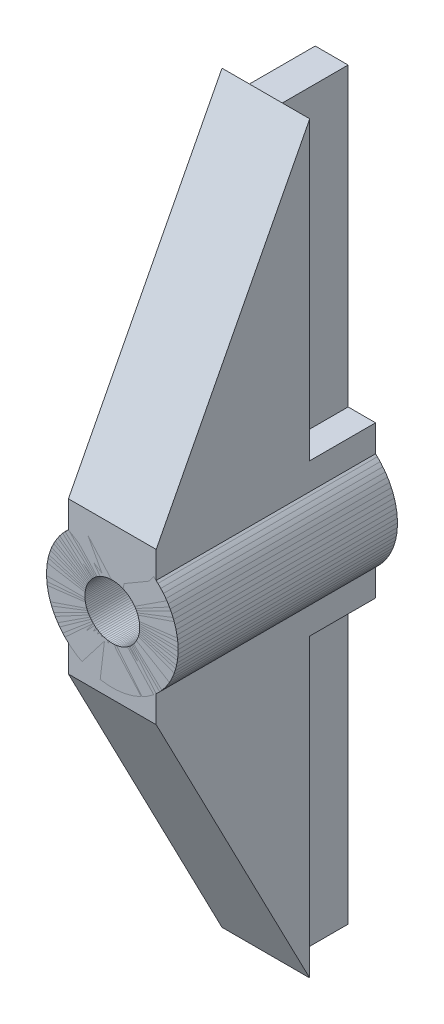
ISO-10303-21;
HEADER;
FILE_DESCRIPTION(('STEP AP214'),'2;1');
FILE_NAME('part.step','',(''),(''),'','','');
FILE_SCHEMA(('AUTOMOTIVE_DESIGN { 1 0 10303 214 1 1 1 1 }'));
ENDSEC;
DATA;
#1=APPLICATION_CONTEXT('core data for automotive mechanical design processes');
#2=APPLICATION_PROTOCOL_DEFINITION('international standard','automotive_design',2000,#1);
#3=PRODUCT_CONTEXT('',#1,'mechanical');
#4=PRODUCT('Part','Part','',(#3));
#5=PRODUCT_RELATED_PRODUCT_CATEGORY('part','',(#4));
#6=PRODUCT_DEFINITION_FORMATION('','',#4);
#7=PRODUCT_DEFINITION_CONTEXT('part definition',#1,'design');
#8=PRODUCT_DEFINITION('design','',#6,#7);
#9=PRODUCT_DEFINITION_SHAPE('','',#8);
#10=(LENGTH_UNIT() NAMED_UNIT(*) SI_UNIT(.MILLI.,.METRE.));
#11=(NAMED_UNIT(*) PLANE_ANGLE_UNIT() SI_UNIT($,.RADIAN.));
#12=(NAMED_UNIT(*) SI_UNIT($,.STERADIAN.) SOLID_ANGLE_UNIT());
#13=UNCERTAINTY_MEASURE_WITH_UNIT(LENGTH_MEASURE(1.E-05),#10,'distance_accuracy_value','');
#14=(GEOMETRIC_REPRESENTATION_CONTEXT(3) GLOBAL_UNCERTAINTY_ASSIGNED_CONTEXT((#13)) GLOBAL_UNIT_ASSIGNED_CONTEXT((#10,
#11,#12)) REPRESENTATION_CONTEXT('',''));
#15=CARTESIAN_POINT('',(0.,0.,0.));
#16=DIRECTION('',(0.,0.,1.));
#17=DIRECTION('',(1.,0.,0.));
#18=AXIS2_PLACEMENT_3D('',#15,#16,#17);
#19=CARTESIAN_POINT('',(0.,0.,20.));
#20=DIRECTION('',(0.,0.,-1.));
#21=DIRECTION('',(1.,0.,0.));
#22=AXIS2_PLACEMENT_3D('',#19,#20,#21);
#23=CYLINDRICAL_SURFACE('',#22,6.);
#24=DIRECTION('',(0.,0.,-1.));
#25=VECTOR('',#24,1.);
#26=CARTESIAN_POINT('',(-3.99999999999997,-4.47213595499961,20.));
#27=LINE('',#26,#25);
#28=CARTESIAN_POINT('',(-3.99999999999997,-4.47213595499961,20.));
#29=VERTEX_POINT('',#28);
#30=CARTESIAN_POINT('',(-3.99999999999997,-4.47213595499961,0.));
#31=VERTEX_POINT('',#30);
#32=EDGE_CURVE('E12',#29,#31,#27,.T.);
#33=ORIENTED_EDGE('',*,*,#32,.F.);
#34=CARTESIAN_POINT('',(0.,0.,20.));
#35=DIRECTION('',(0.,0.,1.));
#36=DIRECTION('',(-1.,0.,0.));
#37=AXIS2_PLACEMENT_3D('',#34,#35,#36);
#38=CIRCLE('',#37,6.);
#39=CARTESIAN_POINT('',(4.00000000000003,-4.47213595499955,20.));
#40=VERTEX_POINT('',#39);
#41=EDGE_CURVE('E210',#40,#29,#38,.T.);
#42=ORIENTED_EDGE('',*,*,#41,.F.);
#43=DIRECTION('',(0.,0.,-1.));
#44=VECTOR('',#43,1.);
#45=CARTESIAN_POINT('',(4.00000000000003,-4.47213595499955,20.));
#46=LINE('',#45,#44);
#47=CARTESIAN_POINT('',(4.00000000000003,-4.47213595499955,0.));
#48=VERTEX_POINT('',#47);
#49=EDGE_CURVE('E62',#40,#48,#46,.T.);
#50=ORIENTED_EDGE('',*,*,#49,.T.);
#51=CARTESIAN_POINT('',(0.,0.,0.));
#52=DIRECTION('',(0.,0.,1.));
#53=DIRECTION('',(-1.,0.,0.));
#54=AXIS2_PLACEMENT_3D('',#51,#52,#53);
#55=CIRCLE('',#54,6.);
#56=EDGE_CURVE('E207',#48,#31,#55,.T.);
#57=ORIENTED_EDGE('',*,*,#56,.T.);
#58=EDGE_LOOP('',(#33,#42,#50,#57));
#59=FACE_BOUND('',#58,.T.);
#60=ADVANCED_FACE('F55',(#59),#23,.T.);
#61=CARTESIAN_POINT('',(0.,0.,20.));
#62=DIRECTION('',(0.,0.,1.));
#63=DIRECTION('',(-1.,0.,0.));
#64=AXIS2_PLACEMENT_3D('',#61,#62,#63);
#65=PLANE('',#64);
#66=ORIENTED_EDGE('',*,*,#41,.T.);
#67=DIRECTION('',(0.,1.,0.));
#68=VECTOR('',#67,1.);
#69=CARTESIAN_POINT('',(-3.99999999999995,-6.91977190049356,20.));
#70=LINE('',#69,#68);
#71=CARTESIAN_POINT('',(-3.99999999999995,-6.91977190049356,20.));
#72=VERTEX_POINT('',#71);
#73=EDGE_CURVE('E183',#72,#29,#70,.T.);
#74=ORIENTED_EDGE('',*,*,#73,.F.);
#75=DIRECTION('',(1.,0.,0.));
#76=VECTOR('',#75,1.);
#77=CARTESIAN_POINT('',(-3.99999999999995,-6.91977190049356,20.));
#78=LINE('',#77,#76);
#79=CARTESIAN_POINT('',(4.00000000000005,-6.9197719004935,20.));
#80=VERTEX_POINT('',#79);
#81=EDGE_CURVE('E200',#72,#80,#78,.T.);
#82=ORIENTED_EDGE('',*,*,#81,.T.);
#83=DIRECTION('',(0.,1.,0.));
#84=VECTOR('',#83,1.);
#85=CARTESIAN_POINT('',(4.00000000000005,-6.9197719004935,20.));
#86=LINE('',#85,#84);
#87=EDGE_CURVE('E190',#80,#40,#86,.T.);
#88=ORIENTED_EDGE('',*,*,#87,.T.);
#89=EDGE_LOOP('',(#66,#74,#82,#88));
#90=FACE_BOUND('',#89,.T.);
#91=CARTESIAN_POINT('',(0.,0.,20.));
#92=DIRECTION('',(0.,0.,1.));
#93=DIRECTION('',(-1.,0.,0.));
#94=AXIS2_PLACEMENT_3D('',#91,#92,#93);
#95=CIRCLE('',#94,2.5);
#96=CARTESIAN_POINT('',(-2.5,0.,20.));
#97=VERTEX_POINT('',#96);
#98=EDGE_CURVE('E204',#97,#97,#95,.T.);
#99=ORIENTED_EDGE('',*,*,#98,.F.);
#100=EDGE_LOOP('',(#99));
#101=FACE_BOUND('',#100,.T.);
#102=ADVANCED_FACE('F227',(#90,#101),#65,.T.);
#103=CARTESIAN_POINT('',(0.,0.,0.));
#104=DIRECTION('',(0.,0.,1.));
#105=DIRECTION('',(-1.,0.,0.));
#106=AXIS2_PLACEMENT_3D('',#103,#104,#105);
#107=PLANE('',#106);
#108=DIRECTION('',(1.,0.,0.));
#109=VECTOR('',#108,1.);
#110=CARTESIAN_POINT('',(4.00000000000005,-6.9197719004935,0.));
#111=LINE('',#110,#109);
#112=CARTESIAN_POINT('',(1.50000000000005,-6.91977190049352,0.));
#113=VERTEX_POINT('',#112);
#114=CARTESIAN_POINT('',(4.00000000000005,-6.9197719004935,0.));
#115=VERTEX_POINT('',#114);
#116=EDGE_CURVE('E147',#113,#115,#111,.T.);
#117=ORIENTED_EDGE('',*,*,#116,.F.);
#118=DIRECTION('',(0.,-1.,0.));
#119=VECTOR('',#118,1.);
#120=CARTESIAN_POINT('',(1.50000000000005,-6.91977190049352,0.));
#121=LINE('',#120,#119);
#122=CARTESIAN_POINT('',(1.50000000000024,-33.9197719004935,0.));
#123=VERTEX_POINT('',#122);
#124=EDGE_CURVE('E155',#113,#123,#121,.T.);
#125=ORIENTED_EDGE('',*,*,#124,.T.);
#126=DIRECTION('',(1.,0.,0.));
#127=VECTOR('',#126,1.);
#128=CARTESIAN_POINT('',(-3.99999999999976,-33.9197719004936,0.));
#129=LINE('',#128,#127);
#130=CARTESIAN_POINT('',(-1.49999999999976,-33.9197719004935,0.));
#131=VERTEX_POINT('',#130);
#132=EDGE_CURVE('E197',#131,#123,#129,.T.);
#133=ORIENTED_EDGE('',*,*,#132,.F.);
#134=DIRECTION('',(0.,-1.,0.));
#135=VECTOR('',#134,1.);
#136=CARTESIAN_POINT('',(-1.49999999999995,-6.91977190049354,0.));
#137=LINE('',#136,#135);
#138=CARTESIAN_POINT('',(-1.49999999999995,-6.91977190049354,0.));
#139=VERTEX_POINT('',#138);
#140=EDGE_CURVE('E69',#139,#131,#137,.T.);
#141=ORIENTED_EDGE('',*,*,#140,.F.);
#142=DIRECTION('',(1.,0.,0.));
#143=VECTOR('',#142,1.);
#144=CARTESIAN_POINT('',(-3.99999999999995,-6.91977190049356,0.));
#145=LINE('',#144,#143);
#146=CARTESIAN_POINT('',(-3.99999999999995,-6.91977190049356,0.));
#147=VERTEX_POINT('',#146);
#148=EDGE_CURVE('E176',#147,#139,#145,.T.);
#149=ORIENTED_EDGE('',*,*,#148,.F.);
#150=DIRECTION('',(0.,-1.,0.));
#151=VECTOR('',#150,1.);
#152=CARTESIAN_POINT('',(-3.99999999999997,-3.91977190049356,0.));
#153=LINE('',#152,#151);
#154=EDGE_CURVE('E185',#31,#147,#153,.T.);
#155=ORIENTED_EDGE('',*,*,#154,.F.);
#156=ORIENTED_EDGE('',*,*,#56,.F.);
#157=DIRECTION('',(0.,-1.,0.));
#158=VECTOR('',#157,1.);
#159=CARTESIAN_POINT('',(4.00000000000003,-3.9197719004935,0.));
#160=LINE('',#159,#158);
#161=EDGE_CURVE('E77',#48,#115,#160,.T.);
#162=ORIENTED_EDGE('',*,*,#161,.T.);
#163=EDGE_LOOP('',(#117,#125,#133,#141,#149,#155,#156,#162));
#164=FACE_BOUND('',#163,.T.);
#165=CARTESIAN_POINT('',(0.,0.,0.));
#166=DIRECTION('',(0.,0.,1.));
#167=DIRECTION('',(-1.,0.,0.));
#168=AXIS2_PLACEMENT_3D('',#165,#166,#167);
#169=CIRCLE('',#168,2.5);
#170=CARTESIAN_POINT('',(-2.5,0.,0.));
#171=VERTEX_POINT('',#170);
#172=EDGE_CURVE('E203',#171,#171,#169,.T.);
#173=ORIENTED_EDGE('',*,*,#172,.T.);
#174=EDGE_LOOP('',(#173));
#175=FACE_BOUND('',#174,.T.);
#176=ADVANCED_FACE('F220',(#164,#175),#107,.F.);
#177=CARTESIAN_POINT('',(0.,0.,20.));
#178=DIRECTION('',(0.,0.,-1.));
#179=DIRECTION('',(1.,0.,0.));
#180=AXIS2_PLACEMENT_3D('',#177,#178,#179);
#181=CYLINDRICAL_SURFACE('',#180,2.5);
#182=ORIENTED_EDGE('',*,*,#98,.T.);
#183=EDGE_LOOP('',(#182));
#184=FACE_BOUND('',#183,.T.);
#185=ORIENTED_EDGE('',*,*,#172,.F.);
#186=EDGE_LOOP('',(#185));
#187=FACE_BOUND('',#186,.T.);
#188=ADVANCED_FACE('F267',(#184,#187),#181,.F.);
#189=CARTESIAN_POINT('',(-4.,0.,0.));
#190=DIRECTION('',(1.,0.,0.));
#191=DIRECTION('',(0.,0.,1.));
#192=AXIS2_PLACEMENT_3D('',#189,#190,#191);
#193=PLANE('',#192);
#194=DIRECTION('',(0.,0.,-1.));
#195=VECTOR('',#194,1.);
#196=CARTESIAN_POINT('',(-3.99999999999995,-6.91977190049356,6.));
#197=LINE('',#196,#195);
#198=CARTESIAN_POINT('',(-3.99999999999995,-6.91977190049356,6.));
#199=VERTEX_POINT('',#198);
#200=EDGE_CURVE('E170',#199,#147,#197,.T.);
#201=ORIENTED_EDGE('',*,*,#200,.F.);
#202=DIRECTION('',(0.,-1.,0.));
#203=VECTOR('',#202,1.);
#204=CARTESIAN_POINT('',(-3.99999999999995,-6.91977190049356,6.));
#205=LINE('',#204,#203);
#206=CARTESIAN_POINT('',(-3.99999999999976,-33.9197719004936,6.));
#207=VERTEX_POINT('',#206);
#208=EDGE_CURVE('E164',#199,#207,#205,.T.);
#209=ORIENTED_EDGE('',*,*,#208,.T.);
#210=DIRECTION('',(0.,0.887754531448929,0.460317164455));
#211=VECTOR('',#210,1.);
#212=CARTESIAN_POINT('',(-3.99999999999995,-6.91977190049356,20.));
#213=LINE('',#212,#211);
#214=EDGE_CURVE('E180',#207,#72,#213,.T.);
#215=ORIENTED_EDGE('',*,*,#214,.T.);
#216=ORIENTED_EDGE('',*,*,#73,.T.);
#217=ORIENTED_EDGE('',*,*,#32,.T.);
#218=ORIENTED_EDGE('',*,*,#154,.T.);
#219=EDGE_LOOP('',(#201,#209,#215,#216,#217,#218));
#220=FACE_BOUND('',#219,.T.);
#221=ADVANCED_FACE('F225',(#220),#193,.F.);
#222=CARTESIAN_POINT('',(4.,0.,0.));
#223=DIRECTION('',(1.,0.,0.));
#224=DIRECTION('',(0.,0.,1.));
#225=AXIS2_PLACEMENT_3D('',#222,#223,#224);
#226=PLANE('',#225);
#227=DIRECTION('',(0.,-1.,0.));
#228=VECTOR('',#227,1.);
#229=CARTESIAN_POINT('',(4.00000000000005,-6.9197719004935,6.));
#230=LINE('',#229,#228);
#231=CARTESIAN_POINT('',(4.00000000000005,-6.9197719004935,6.));
#232=VERTEX_POINT('',#231);
#233=CARTESIAN_POINT('',(4.00000000000024,-33.9197719004935,6.));
#234=VERTEX_POINT('',#233);
#235=EDGE_CURVE('E136',#232,#234,#230,.T.);
#236=ORIENTED_EDGE('',*,*,#235,.F.);
#237=DIRECTION('',(0.,0.,1.));
#238=VECTOR('',#237,1.);
#239=CARTESIAN_POINT('',(4.00000000000005,-6.9197719004935,6.));
#240=LINE('',#239,#238);
#241=EDGE_CURVE('E143',#115,#232,#240,.T.);
#242=ORIENTED_EDGE('',*,*,#241,.F.);
#243=ORIENTED_EDGE('',*,*,#161,.F.);
#244=ORIENTED_EDGE('',*,*,#49,.F.);
#245=ORIENTED_EDGE('',*,*,#87,.F.);
#246=DIRECTION('',(0.,0.887754531448929,0.460317164455));
#247=VECTOR('',#246,1.);
#248=CARTESIAN_POINT('',(4.00000000000005,-6.9197719004935,20.));
#249=LINE('',#248,#247);
#250=EDGE_CURVE('E153',#234,#80,#249,.T.);
#251=ORIENTED_EDGE('',*,*,#250,.F.);
#252=EDGE_LOOP('',(#236,#242,#243,#244,#245,#251));
#253=FACE_BOUND('',#252,.T.);
#254=ADVANCED_FACE('F151',(#253),#226,.T.);
#255=CARTESIAN_POINT('',(-3.99999999999995,-6.91977190049356,20.));
#256=DIRECTION('',(0.,0.460317164455,-0.887754531448929));
#257=DIRECTION('',(0.,-0.887754531448929,-0.460317164455));
#258=AXIS2_PLACEMENT_3D('',#255,#256,#257);
#259=PLANE('',#258);
#260=ORIENTED_EDGE('',*,*,#250,.T.);
#261=ORIENTED_EDGE('',*,*,#81,.F.);
#262=ORIENTED_EDGE('',*,*,#214,.F.);
#263=DIRECTION('',(1.,0.,0.));
#264=VECTOR('',#263,1.);
#265=CARTESIAN_POINT('',(-3.99999999999976,-33.9197719004936,6.));
#266=LINE('',#265,#264);
#267=CARTESIAN_POINT('',(-1.49999999999976,-33.9197719004935,6.));
#268=VERTEX_POINT('',#267);
#269=EDGE_CURVE('E194',#207,#268,#266,.T.);
#270=ORIENTED_EDGE('',*,*,#269,.T.);
#271=CARTESIAN_POINT('',(1.50000000000024,-33.9197719004935,6.));
#272=VERTEX_POINT('',#271);
#273=EDGE_CURVE('E188',#268,#272,#266,.T.);
#274=ORIENTED_EDGE('',*,*,#273,.T.);
#275=DIRECTION('',(-1.,0.,0.));
#276=VECTOR('',#275,1.);
#277=CARTESIAN_POINT('',(1.50000000000024,-33.9197719004935,6.));
#278=LINE('',#277,#276);
#279=EDGE_CURVE('E169',#234,#272,#278,.T.);
#280=ORIENTED_EDGE('',*,*,#279,.F.);
#281=EDGE_LOOP('',(#260,#261,#262,#270,#274,#280));
#282=FACE_BOUND('',#281,.T.);
#283=ADVANCED_FACE('F232',(#282),#259,.F.);
#284=CARTESIAN_POINT('',(-3.99999999999976,-33.9197719004936,6.));
#285=DIRECTION('',(0.,1.,0.));
#286=DIRECTION('',(0.,0.,-1.));
#287=AXIS2_PLACEMENT_3D('',#284,#285,#286);
#288=PLANE('',#287);
#289=ORIENTED_EDGE('',*,*,#132,.T.);
#290=DIRECTION('',(0.,0.,-1.));
#291=VECTOR('',#290,1.);
#292=CARTESIAN_POINT('',(1.50000000000024,-33.9197719004935,0.));
#293=LINE('',#292,#291);
#294=EDGE_CURVE('E148',#272,#123,#293,.T.);
#295=ORIENTED_EDGE('',*,*,#294,.F.);
#296=ORIENTED_EDGE('',*,*,#273,.F.);
#297=DIRECTION('',(0.,0.,1.));
#298=VECTOR('',#297,1.);
#299=CARTESIAN_POINT('',(-1.49999999999976,-33.9197719004935,0.));
#300=LINE('',#299,#298);
#301=EDGE_CURVE('E167',#131,#268,#300,.T.);
#302=ORIENTED_EDGE('',*,*,#301,.F.);
#303=EDGE_LOOP('',(#289,#295,#296,#302));
#304=FACE_BOUND('',#303,.T.);
#305=ADVANCED_FACE('F243',(#304),#288,.F.);
#306=CARTESIAN_POINT('',(-1.49999999999995,-6.91977190049354,6.));
#307=DIRECTION('',(0.,0.,1.));
#308=DIRECTION('',(-1.,0.,0.));
#309=AXIS2_PLACEMENT_3D('',#306,#307,#308);
#310=PLANE('',#309);
#311=ORIENTED_EDGE('',*,*,#269,.F.);
#312=ORIENTED_EDGE('',*,*,#208,.F.);
#313=DIRECTION('',(-1.,0.,0.));
#314=VECTOR('',#313,1.);
#315=CARTESIAN_POINT('',(-1.49999999999995,-6.91977190049354,6.));
#316=LINE('',#315,#314);
#317=CARTESIAN_POINT('',(-1.49999999999995,-6.91977190049354,6.));
#318=VERTEX_POINT('',#317);
#319=EDGE_CURVE('E161',#318,#199,#316,.T.);
#320=ORIENTED_EDGE('',*,*,#319,.F.);
#321=DIRECTION('',(0.,-1.,0.));
#322=VECTOR('',#321,1.);
#323=CARTESIAN_POINT('',(-1.49999999999995,-6.91977190049354,6.));
#324=LINE('',#323,#322);
#325=EDGE_CURVE('E162',#318,#268,#324,.T.);
#326=ORIENTED_EDGE('',*,*,#325,.T.);
#327=EDGE_LOOP('',(#311,#312,#320,#326));
#328=FACE_BOUND('',#327,.T.);
#329=ADVANCED_FACE('F249',(#328),#310,.F.);
#330=CARTESIAN_POINT('',(-1.49999999999995,-6.91977190049354,0.));
#331=DIRECTION('',(1.,0.,0.));
#332=DIRECTION('',(0.,0.,1.));
#333=AXIS2_PLACEMENT_3D('',#330,#331,#332);
#334=PLANE('',#333);
#335=ORIENTED_EDGE('',*,*,#301,.T.);
#336=ORIENTED_EDGE('',*,*,#325,.F.);
#337=DIRECTION('',(0.,0.,1.));
#338=VECTOR('',#337,1.);
#339=CARTESIAN_POINT('',(-1.49999999999995,-6.91977190049354,0.));
#340=LINE('',#339,#338);
#341=EDGE_CURVE('E173',#139,#318,#340,.T.);
#342=ORIENTED_EDGE('',*,*,#341,.F.);
#343=ORIENTED_EDGE('',*,*,#140,.T.);
#344=EDGE_LOOP('',(#335,#336,#342,#343));
#345=FACE_BOUND('',#344,.T.);
#346=ADVANCED_FACE('F244',(#345),#334,.F.);
#347=CARTESIAN_POINT('',(0.,-6.91977190049353,0.));
#348=DIRECTION('',(0.,-1.,0.));
#349=DIRECTION('',(0.,0.,1.));
#350=AXIS2_PLACEMENT_3D('',#347,#348,#349);
#351=PLANE('',#350);
#352=ORIENTED_EDGE('',*,*,#200,.T.);
#353=ORIENTED_EDGE('',*,*,#148,.T.);
#354=ORIENTED_EDGE('',*,*,#341,.T.);
#355=ORIENTED_EDGE('',*,*,#319,.T.);
#356=EDGE_LOOP('',(#352,#353,#354,#355));
#357=FACE_BOUND('',#356,.T.);
#358=ADVANCED_FACE('F248',(#357),#351,.T.);
#359=CARTESIAN_POINT('',(1.50000000000005,-6.91977190049352,0.));
#360=DIRECTION('',(-1.,0.,0.));
#361=DIRECTION('',(0.,0.,-1.));
#362=AXIS2_PLACEMENT_3D('',#359,#360,#361);
#363=PLANE('',#362);
#364=ORIENTED_EDGE('',*,*,#294,.T.);
#365=ORIENTED_EDGE('',*,*,#124,.F.);
#366=DIRECTION('',(0.,0.,-1.));
#367=VECTOR('',#366,1.);
#368=CARTESIAN_POINT('',(1.50000000000005,-6.91977190049352,0.));
#369=LINE('',#368,#367);
#370=CARTESIAN_POINT('',(1.50000000000005,-6.91977190049352,6.));
#371=VERTEX_POINT('',#370);
#372=EDGE_CURVE('E142',#371,#113,#369,.T.);
#373=ORIENTED_EDGE('',*,*,#372,.F.);
#374=DIRECTION('',(0.,-1.,0.));
#375=VECTOR('',#374,1.);
#376=CARTESIAN_POINT('',(1.50000000000005,-6.91977190049352,6.));
#377=LINE('',#376,#375);
#378=EDGE_CURVE('E138',#371,#272,#377,.T.);
#379=ORIENTED_EDGE('',*,*,#378,.T.);
#380=EDGE_LOOP('',(#364,#365,#373,#379));
#381=FACE_BOUND('',#380,.T.);
#382=ADVANCED_FACE('F278',(#381),#363,.F.);
#383=CARTESIAN_POINT('',(1.50000000000005,-6.91977190049352,6.));
#384=DIRECTION('',(0.,0.,1.));
#385=DIRECTION('',(-1.,0.,0.));
#386=AXIS2_PLACEMENT_3D('',#383,#384,#385);
#387=PLANE('',#386);
#388=ORIENTED_EDGE('',*,*,#279,.T.);
#389=ORIENTED_EDGE('',*,*,#378,.F.);
#390=DIRECTION('',(-1.,0.,0.));
#391=VECTOR('',#390,1.);
#392=CARTESIAN_POINT('',(1.50000000000005,-6.91977190049352,6.));
#393=LINE('',#392,#391);
#394=EDGE_CURVE('E131',#232,#371,#393,.T.);
#395=ORIENTED_EDGE('',*,*,#394,.F.);
#396=ORIENTED_EDGE('',*,*,#235,.T.);
#397=EDGE_LOOP('',(#388,#389,#395,#396));
#398=FACE_BOUND('',#397,.T.);
#399=ADVANCED_FACE('F134',(#398),#387,.F.);
#400=CARTESIAN_POINT('',(0.,-6.91977190049353,0.));
#401=DIRECTION('',(0.,1.,0.));
#402=DIRECTION('',(0.,0.,-1.));
#403=AXIS2_PLACEMENT_3D('',#400,#401,#402);
#404=PLANE('',#403);
#405=ORIENTED_EDGE('',*,*,#241,.T.);
#406=ORIENTED_EDGE('',*,*,#394,.T.);
#407=ORIENTED_EDGE('',*,*,#372,.T.);
#408=ORIENTED_EDGE('',*,*,#116,.T.);
#409=EDGE_LOOP('',(#405,#406,#407,#408));
#410=FACE_BOUND('',#409,.T.);
#411=ADVANCED_FACE('F145',(#410),#404,.F.);
#412=CLOSED_SHELL('',(#60,#102,#176,#188,#221,#254,#283,#305,#329,#346,#358,#382,#399,#411));
#413=MANIFOLD_SOLID_BREP('B2',#412);
#414=CARTESIAN_POINT('',(0.,0.,20.));
#415=DIRECTION('',(0.,0.,-1.));
#416=DIRECTION('',(-1.,0.,0.));
#417=AXIS2_PLACEMENT_3D('',#414,#415,#416);
#418=CYLINDRICAL_SURFACE('',#417,6.);
#419=DIRECTION('',(0.,0.,-1.));
#420=VECTOR('',#419,1.);
#421=CARTESIAN_POINT('',(4.,4.47213595499958,20.));
#422=LINE('',#421,#420);
#423=CARTESIAN_POINT('',(4.,4.47213595499958,20.));
#424=VERTEX_POINT('',#423);
#425=CARTESIAN_POINT('',(4.,4.47213595499958,0.));
#426=VERTEX_POINT('',#425);
#427=EDGE_CURVE('E53',#424,#426,#422,.T.);
#428=ORIENTED_EDGE('',*,*,#427,.F.);
#429=CARTESIAN_POINT('',(0.,0.,20.));
#430=DIRECTION('',(0.,0.,1.));
#431=DIRECTION('',(1.,0.,0.));
#432=AXIS2_PLACEMENT_3D('',#429,#430,#431);
#433=CIRCLE('',#432,6.);
#434=CARTESIAN_POINT('',(-4.,4.47213595499958,20.));
#435=VERTEX_POINT('',#434);
#436=EDGE_CURVE('E555',#435,#424,#433,.T.);
#437=ORIENTED_EDGE('',*,*,#436,.F.);
#438=DIRECTION('',(0.,0.,-1.));
#439=VECTOR('',#438,1.);
#440=CARTESIAN_POINT('',(-4.,4.47213595499958,20.));
#441=LINE('',#440,#439);
#442=CARTESIAN_POINT('',(-4.,4.47213595499958,0.));
#443=VERTEX_POINT('',#442);
#444=EDGE_CURVE('E383',#435,#443,#441,.T.);
#445=ORIENTED_EDGE('',*,*,#444,.T.);
#446=CARTESIAN_POINT('',(0.,0.,0.));
#447=DIRECTION('',(0.,0.,1.));
#448=DIRECTION('',(1.,0.,0.));
#449=AXIS2_PLACEMENT_3D('',#446,#447,#448);
#450=CIRCLE('',#449,6.);
#451=EDGE_CURVE('E551',#443,#426,#450,.T.);
#452=ORIENTED_EDGE('',*,*,#451,.T.);
#453=EDGE_LOOP('',(#428,#437,#445,#452));
#454=FACE_BOUND('',#453,.T.);
#455=ADVANCED_FACE('F375',(#454),#418,.T.);
#456=CARTESIAN_POINT('',(0.,0.,20.));
#457=DIRECTION('',(0.,0.,1.));
#458=DIRECTION('',(1.,0.,0.));
#459=AXIS2_PLACEMENT_3D('',#456,#457,#458);
#460=PLANE('',#459);
#461=ORIENTED_EDGE('',*,*,#436,.T.);
#462=DIRECTION('',(0.,-1.,0.));
#463=VECTOR('',#462,1.);
#464=CARTESIAN_POINT('',(4.,6.91977190049353,20.));
#465=LINE('',#464,#463);
#466=CARTESIAN_POINT('',(4.,6.91977190049353,20.));
#467=VERTEX_POINT('',#466);
#468=EDGE_CURVE('E518',#467,#424,#465,.T.);
#469=ORIENTED_EDGE('',*,*,#468,.F.);
#470=DIRECTION('',(-1.,0.,0.));
#471=VECTOR('',#470,1.);
#472=CARTESIAN_POINT('',(4.,6.91977190049353,20.));
#473=LINE('',#472,#471);
#474=CARTESIAN_POINT('',(-4.,6.91977190049353,20.));
#475=VERTEX_POINT('',#474);
#476=EDGE_CURVE('E542',#467,#475,#473,.T.);
#477=ORIENTED_EDGE('',*,*,#476,.T.);
#478=DIRECTION('',(0.,-1.,0.));
#479=VECTOR('',#478,1.);
#480=CARTESIAN_POINT('',(-4.,6.91977190049353,20.));
#481=LINE('',#480,#479);
#482=EDGE_CURVE('E528',#475,#435,#481,.T.);
#483=ORIENTED_EDGE('',*,*,#482,.T.);
#484=EDGE_LOOP('',(#461,#469,#477,#483));
#485=FACE_BOUND('',#484,.T.);
#486=CARTESIAN_POINT('',(0.,0.,20.));
#487=DIRECTION('',(0.,0.,1.));
#488=DIRECTION('',(1.,0.,0.));
#489=AXIS2_PLACEMENT_3D('',#486,#487,#488);
#490=CIRCLE('',#489,2.5);
#491=CARTESIAN_POINT('',(2.5,0.,20.));
#492=VERTEX_POINT('',#491);
#493=EDGE_CURVE('E547',#492,#492,#490,.T.);
#494=ORIENTED_EDGE('',*,*,#493,.F.);
#495=EDGE_LOOP('',(#494));
#496=FACE_BOUND('',#495,.T.);
#497=ADVANCED_FACE('F575',(#485,#496),#460,.T.);
#498=CARTESIAN_POINT('',(0.,0.,0.));
#499=DIRECTION('',(0.,0.,1.));
#500=DIRECTION('',(1.,0.,0.));
#501=AXIS2_PLACEMENT_3D('',#498,#499,#500);
#502=PLANE('',#501);
#503=DIRECTION('',(-1.,0.,0.));
#504=VECTOR('',#503,1.);
#505=CARTESIAN_POINT('',(-4.,6.91977190049353,0.));
#506=LINE('',#505,#504);
#507=CARTESIAN_POINT('',(-1.5,6.91977190049353,0.));
#508=VERTEX_POINT('',#507);
#509=CARTESIAN_POINT('',(-4.,6.91977190049353,0.));
#510=VERTEX_POINT('',#509);
#511=EDGE_CURVE('E469',#508,#510,#506,.T.);
#512=ORIENTED_EDGE('',*,*,#511,.F.);
#513=DIRECTION('',(0.,1.,0.));
#514=VECTOR('',#513,1.);
#515=CARTESIAN_POINT('',(-1.5,6.91977190049353,0.));
#516=LINE('',#515,#514);
#517=CARTESIAN_POINT('',(-1.5,33.9197719004935,0.));
#518=VERTEX_POINT('',#517);
#519=EDGE_CURVE('E481',#508,#518,#516,.T.);
#520=ORIENTED_EDGE('',*,*,#519,.T.);
#521=DIRECTION('',(-1.,0.,0.));
#522=VECTOR('',#521,1.);
#523=CARTESIAN_POINT('',(4.,33.9197719004935,0.));
#524=LINE('',#523,#522);
#525=CARTESIAN_POINT('',(1.5,33.9197719004935,0.));
#526=VERTEX_POINT('',#525);
#527=EDGE_CURVE('E538',#526,#518,#524,.T.);
#528=ORIENTED_EDGE('',*,*,#527,.F.);
#529=DIRECTION('',(0.,1.,0.));
#530=VECTOR('',#529,1.);
#531=CARTESIAN_POINT('',(1.5,6.91977190049353,0.));
#532=LINE('',#531,#530);
#533=CARTESIAN_POINT('',(1.5,6.91977190049353,0.));
#534=VERTEX_POINT('',#533);
#535=EDGE_CURVE('E390',#534,#526,#532,.T.);
#536=ORIENTED_EDGE('',*,*,#535,.F.);
#537=DIRECTION('',(-1.,0.,0.));
#538=VECTOR('',#537,1.);
#539=CARTESIAN_POINT('',(4.,6.91977190049353,0.));
#540=LINE('',#539,#538);
#541=CARTESIAN_POINT('',(4.,6.91977190049353,0.));
#542=VERTEX_POINT('',#541);
#543=EDGE_CURVE('E508',#542,#534,#540,.T.);
#544=ORIENTED_EDGE('',*,*,#543,.F.);
#545=DIRECTION('',(0.,1.,0.));
#546=VECTOR('',#545,1.);
#547=CARTESIAN_POINT('',(4.,3.91977190049353,0.));
#548=LINE('',#547,#546);
#549=EDGE_CURVE('E521',#426,#542,#548,.T.);
#550=ORIENTED_EDGE('',*,*,#549,.F.);
#551=ORIENTED_EDGE('',*,*,#451,.F.);
#552=DIRECTION('',(0.,1.,0.));
#553=VECTOR('',#552,1.);
#554=CARTESIAN_POINT('',(-4.,3.91977190049353,0.));
#555=LINE('',#554,#553);
#556=EDGE_CURVE('E398',#443,#510,#555,.T.);
#557=ORIENTED_EDGE('',*,*,#556,.T.);
#558=EDGE_LOOP('',(#512,#520,#528,#536,#544,#550,#551,#557));
#559=FACE_BOUND('',#558,.T.);
#560=CARTESIAN_POINT('',(0.,0.,0.));
#561=DIRECTION('',(0.,0.,1.));
#562=DIRECTION('',(1.,0.,0.));
#563=AXIS2_PLACEMENT_3D('',#560,#561,#562);
#564=CIRCLE('',#563,2.5);
#565=CARTESIAN_POINT('',(2.5,0.,0.));
#566=VERTEX_POINT('',#565);
#567=EDGE_CURVE('E546',#566,#566,#564,.T.);
#568=ORIENTED_EDGE('',*,*,#567,.T.);
#569=EDGE_LOOP('',(#568));
#570=FACE_BOUND('',#569,.T.);
#571=ADVANCED_FACE('F568',(#559,#570),#502,.F.);
#572=CARTESIAN_POINT('',(0.,0.,20.));
#573=DIRECTION('',(0.,0.,-1.));
#574=DIRECTION('',(-1.,0.,0.));
#575=AXIS2_PLACEMENT_3D('',#572,#573,#574);
#576=CYLINDRICAL_SURFACE('',#575,2.5);
#577=ORIENTED_EDGE('',*,*,#493,.T.);
#578=EDGE_LOOP('',(#577));
#579=FACE_BOUND('',#578,.T.);
#580=ORIENTED_EDGE('',*,*,#567,.F.);
#581=EDGE_LOOP('',(#580));
#582=FACE_BOUND('',#581,.T.);
#583=ADVANCED_FACE('F619',(#579,#582),#576,.F.);
#584=CARTESIAN_POINT('',(4.,0.,0.));
#585=DIRECTION('',(-1.,0.,0.));
#586=DIRECTION('',(0.,0.,1.));
#587=AXIS2_PLACEMENT_3D('',#584,#585,#586);
#588=PLANE('',#587);
#589=DIRECTION('',(0.,0.,-1.));
#590=VECTOR('',#589,1.);
#591=CARTESIAN_POINT('',(4.,6.91977190049353,6.));
#592=LINE('',#591,#590);
#593=CARTESIAN_POINT('',(4.,6.91977190049353,6.));
#594=VERTEX_POINT('',#593);
#595=EDGE_CURVE('E500',#594,#542,#592,.T.);
#596=ORIENTED_EDGE('',*,*,#595,.F.);
#597=DIRECTION('',(0.,1.,0.));
#598=VECTOR('',#597,1.);
#599=CARTESIAN_POINT('',(4.,6.91977190049353,6.));
#600=LINE('',#599,#598);
#601=CARTESIAN_POINT('',(4.,33.9197719004935,6.));
#602=VERTEX_POINT('',#601);
#603=EDGE_CURVE('E492',#594,#602,#600,.T.);
#604=ORIENTED_EDGE('',*,*,#603,.T.);
#605=DIRECTION('',(0.,-0.887754531448929,0.460317164455));
#606=VECTOR('',#605,1.);
#607=CARTESIAN_POINT('',(4.,6.91977190049353,20.));
#608=LINE('',#607,#606);
#609=EDGE_CURVE('E514',#602,#467,#608,.T.);
#610=ORIENTED_EDGE('',*,*,#609,.T.);
#611=ORIENTED_EDGE('',*,*,#468,.T.);
#612=ORIENTED_EDGE('',*,*,#427,.T.);
#613=ORIENTED_EDGE('',*,*,#549,.T.);
#614=EDGE_LOOP('',(#596,#604,#610,#611,#612,#613));
#615=FACE_BOUND('',#614,.T.);
#616=ADVANCED_FACE('F573',(#615),#588,.F.);
#617=CARTESIAN_POINT('',(-4.,0.,0.));
#618=DIRECTION('',(-1.,0.,0.));
#619=DIRECTION('',(0.,0.,1.));
#620=AXIS2_PLACEMENT_3D('',#617,#618,#619);
#621=PLANE('',#620);
#622=DIRECTION('',(0.,1.,0.));
#623=VECTOR('',#622,1.);
#624=CARTESIAN_POINT('',(-4.,6.91977190049353,6.));
#625=LINE('',#624,#623);
#626=CARTESIAN_POINT('',(-4.,6.91977190049353,6.));
#627=VERTEX_POINT('',#626);
#628=CARTESIAN_POINT('',(-4.,33.9197719004935,6.));
#629=VERTEX_POINT('',#628);
#630=EDGE_CURVE('E457',#627,#629,#625,.T.);
#631=ORIENTED_EDGE('',*,*,#630,.F.);
#632=DIRECTION('',(0.,0.,1.));
#633=VECTOR('',#632,1.);
#634=CARTESIAN_POINT('',(-4.,6.91977190049353,6.));
#635=LINE('',#634,#633);
#636=EDGE_CURVE('E465',#510,#627,#635,.T.);
#637=ORIENTED_EDGE('',*,*,#636,.F.);
#638=ORIENTED_EDGE('',*,*,#556,.F.);
#639=ORIENTED_EDGE('',*,*,#444,.F.);
#640=ORIENTED_EDGE('',*,*,#482,.F.);
#641=DIRECTION('',(0.,-0.887754531448929,0.460317164455));
#642=VECTOR('',#641,1.);
#643=CARTESIAN_POINT('',(-4.,6.91977190049353,20.));
#644=LINE('',#643,#642);
#645=EDGE_CURVE('E476',#629,#475,#644,.T.);
#646=ORIENTED_EDGE('',*,*,#645,.F.);
#647=EDGE_LOOP('',(#631,#637,#638,#639,#640,#646));
#648=FACE_BOUND('',#647,.T.);
#649=ADVANCED_FACE('F474',(#648),#621,.T.);
#650=CARTESIAN_POINT('',(4.,6.91977190049353,20.));
#651=DIRECTION('',(0.,-0.460317164455,-0.887754531448929));
#652=DIRECTION('',(0.,0.887754531448929,-0.460317164455));
#653=AXIS2_PLACEMENT_3D('',#650,#651,#652);
#654=PLANE('',#653);
#655=ORIENTED_EDGE('',*,*,#645,.T.);
#656=ORIENTED_EDGE('',*,*,#476,.F.);
#657=ORIENTED_EDGE('',*,*,#609,.F.);
#658=DIRECTION('',(-1.,0.,0.));
#659=VECTOR('',#658,1.);
#660=CARTESIAN_POINT('',(4.,33.9197719004935,6.));
#661=LINE('',#660,#659);
#662=CARTESIAN_POINT('',(1.5,33.9197719004935,6.));
#663=VERTEX_POINT('',#662);
#664=EDGE_CURVE('E534',#602,#663,#661,.T.);
#665=ORIENTED_EDGE('',*,*,#664,.T.);
#666=CARTESIAN_POINT('',(-1.5,33.9197719004935,6.));
#667=VERTEX_POINT('',#666);
#668=EDGE_CURVE('E525',#663,#667,#661,.T.);
#669=ORIENTED_EDGE('',*,*,#668,.T.);
#670=DIRECTION('',(1.,0.,0.));
#671=VECTOR('',#670,1.);
#672=CARTESIAN_POINT('',(-1.5,33.9197719004935,6.));
#673=LINE('',#672,#671);
#674=EDGE_CURVE('E499',#629,#667,#673,.T.);
#675=ORIENTED_EDGE('',*,*,#674,.F.);
#676=EDGE_LOOP('',(#655,#656,#657,#665,#669,#675));
#677=FACE_BOUND('',#676,.T.);
#678=ADVANCED_FACE('F580',(#677),#654,.F.);
#679=CARTESIAN_POINT('',(4.,33.9197719004935,6.));
#680=DIRECTION('',(0.,-1.,0.));
#681=DIRECTION('',(0.,0.,-1.));
#682=AXIS2_PLACEMENT_3D('',#679,#680,#681);
#683=PLANE('',#682);
#684=ORIENTED_EDGE('',*,*,#527,.T.);
#685=DIRECTION('',(0.,0.,-1.));
#686=VECTOR('',#685,1.);
#687=CARTESIAN_POINT('',(-1.5,33.9197719004935,0.));
#688=LINE('',#687,#686);
#689=EDGE_CURVE('E471',#667,#518,#688,.T.);
#690=ORIENTED_EDGE('',*,*,#689,.F.);
#691=ORIENTED_EDGE('',*,*,#668,.F.);
#692=DIRECTION('',(0.,0.,1.));
#693=VECTOR('',#692,1.);
#694=CARTESIAN_POINT('',(1.5,33.9197719004935,0.));
#695=LINE('',#694,#693);
#696=EDGE_CURVE('E496',#526,#663,#695,.T.);
#697=ORIENTED_EDGE('',*,*,#696,.F.);
#698=EDGE_LOOP('',(#684,#690,#691,#697));
#699=FACE_BOUND('',#698,.T.);
#700=ADVANCED_FACE('F594',(#699),#683,.F.);
#701=CARTESIAN_POINT('',(1.5,6.91977190049353,6.));
#702=DIRECTION('',(0.,0.,1.));
#703=DIRECTION('',(1.,0.,0.));
#704=AXIS2_PLACEMENT_3D('',#701,#702,#703);
#705=PLANE('',#704);
#706=ORIENTED_EDGE('',*,*,#664,.F.);
#707=ORIENTED_EDGE('',*,*,#603,.F.);
#708=DIRECTION('',(1.,0.,0.));
#709=VECTOR('',#708,1.);
#710=CARTESIAN_POINT('',(1.5,6.91977190049353,6.));
#711=LINE('',#710,#709);
#712=CARTESIAN_POINT('',(1.5,6.91977190049353,6.));
#713=VERTEX_POINT('',#712);
#714=EDGE_CURVE('E488',#713,#594,#711,.T.);
#715=ORIENTED_EDGE('',*,*,#714,.F.);
#716=DIRECTION('',(0.,1.,0.));
#717=VECTOR('',#716,1.);
#718=CARTESIAN_POINT('',(1.5,6.91977190049353,6.));
#719=LINE('',#718,#717);
#720=EDGE_CURVE('E489',#713,#663,#719,.T.);
#721=ORIENTED_EDGE('',*,*,#720,.T.);
#722=EDGE_LOOP('',(#706,#707,#715,#721));
#723=FACE_BOUND('',#722,.T.);
#724=ADVANCED_FACE('F600',(#723),#705,.F.);
#725=CARTESIAN_POINT('',(1.5,6.91977190049353,0.));
#726=DIRECTION('',(-1.,0.,0.));
#727=DIRECTION('',(0.,0.,1.));
#728=AXIS2_PLACEMENT_3D('',#725,#726,#727);
#729=PLANE('',#728);
#730=ORIENTED_EDGE('',*,*,#696,.T.);
#731=ORIENTED_EDGE('',*,*,#720,.F.);
#732=DIRECTION('',(0.,0.,1.));
#733=VECTOR('',#732,1.);
#734=CARTESIAN_POINT('',(1.5,6.91977190049353,0.));
#735=LINE('',#734,#733);
#736=EDGE_CURVE('E504',#534,#713,#735,.T.);
#737=ORIENTED_EDGE('',*,*,#736,.F.);
#738=ORIENTED_EDGE('',*,*,#535,.T.);
#739=EDGE_LOOP('',(#730,#731,#737,#738));
#740=FACE_BOUND('',#739,.T.);
#741=ADVANCED_FACE('F595',(#740),#729,.F.);
#742=CARTESIAN_POINT('',(0.,6.91977190049353,0.));
#743=DIRECTION('',(0.,1.,0.));
#744=DIRECTION('',(0.,0.,1.));
#745=AXIS2_PLACEMENT_3D('',#742,#743,#744);
#746=PLANE('',#745);
#747=ORIENTED_EDGE('',*,*,#595,.T.);
#748=ORIENTED_EDGE('',*,*,#543,.T.);
#749=ORIENTED_EDGE('',*,*,#736,.T.);
#750=ORIENTED_EDGE('',*,*,#714,.T.);
#751=EDGE_LOOP('',(#747,#748,#749,#750));
#752=FACE_BOUND('',#751,.T.);
#753=ADVANCED_FACE('F599',(#752),#746,.T.);
#754=CARTESIAN_POINT('',(-1.5,6.91977190049353,0.));
#755=DIRECTION('',(1.,0.,0.));
#756=DIRECTION('',(0.,0.,-1.));
#757=AXIS2_PLACEMENT_3D('',#754,#755,#756);
#758=PLANE('',#757);
#759=ORIENTED_EDGE('',*,*,#689,.T.);
#760=ORIENTED_EDGE('',*,*,#519,.F.);
#761=DIRECTION('',(0.,0.,-1.));
#762=VECTOR('',#761,1.);
#763=CARTESIAN_POINT('',(-1.5,6.91977190049353,0.));
#764=LINE('',#763,#762);
#765=CARTESIAN_POINT('',(-1.5,6.91977190049353,6.));
#766=VERTEX_POINT('',#765);
#767=EDGE_CURVE('E464',#766,#508,#764,.T.);
#768=ORIENTED_EDGE('',*,*,#767,.F.);
#769=DIRECTION('',(0.,1.,0.));
#770=VECTOR('',#769,1.);
#771=CARTESIAN_POINT('',(-1.5,6.91977190049353,6.));
#772=LINE('',#771,#770);
#773=EDGE_CURVE('E459',#766,#667,#772,.T.);
#774=ORIENTED_EDGE('',*,*,#773,.T.);
#775=EDGE_LOOP('',(#759,#760,#768,#774));
#776=FACE_BOUND('',#775,.T.);
#777=ADVANCED_FACE('F629',(#776),#758,.F.);
#778=CARTESIAN_POINT('',(-1.5,6.91977190049353,6.));
#779=DIRECTION('',(0.,0.,1.));
#780=DIRECTION('',(1.,0.,0.));
#781=AXIS2_PLACEMENT_3D('',#778,#779,#780);
#782=PLANE('',#781);
#783=ORIENTED_EDGE('',*,*,#674,.T.);
#784=ORIENTED_EDGE('',*,*,#773,.F.);
#785=DIRECTION('',(1.,0.,0.));
#786=VECTOR('',#785,1.);
#787=CARTESIAN_POINT('',(-1.5,6.91977190049353,6.));
#788=LINE('',#787,#786);
#789=EDGE_CURVE('E452',#627,#766,#788,.T.);
#790=ORIENTED_EDGE('',*,*,#789,.F.);
#791=ORIENTED_EDGE('',*,*,#630,.T.);
#792=EDGE_LOOP('',(#783,#784,#790,#791));
#793=FACE_BOUND('',#792,.T.);
#794=ADVANCED_FACE('F455',(#793),#782,.F.);
#795=CARTESIAN_POINT('',(0.,6.91977190049353,0.));
#796=DIRECTION('',(0.,-1.,0.));
#797=DIRECTION('',(0.,0.,-1.));
#798=AXIS2_PLACEMENT_3D('',#795,#796,#797);
#799=PLANE('',#798);
#800=ORIENTED_EDGE('',*,*,#636,.T.);
#801=ORIENTED_EDGE('',*,*,#789,.T.);
#802=ORIENTED_EDGE('',*,*,#767,.T.);
#803=ORIENTED_EDGE('',*,*,#511,.T.);
#804=EDGE_LOOP('',(#800,#801,#802,#803));
#805=FACE_BOUND('',#804,.T.);
#806=ADVANCED_FACE('F467',(#805),#799,.F.);
#807=CLOSED_SHELL('',(#455,#497,#571,#583,#616,#649,#678,#700,#724,#741,#753,#777,#794,#806));
#808=MANIFOLD_SOLID_BREP('B6',#807);
#809=ADVANCED_BREP_SHAPE_REPRESENTATION('',(#18,#413,#808),#14);
#810=SHAPE_DEFINITION_REPRESENTATION(#9,#809);
ENDSEC;
END-ISO-10303-21;
